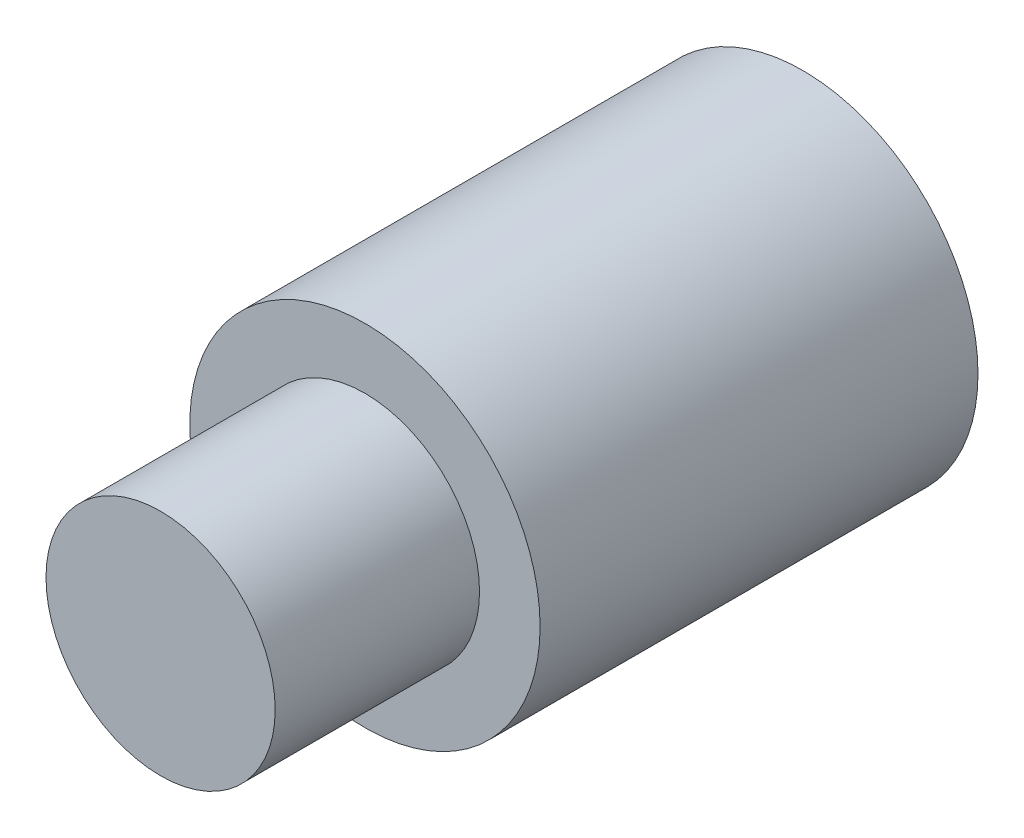
ISO-10303-21;
HEADER;
FILE_DESCRIPTION(('STEP AP214'),'2;1');
FILE_NAME('part.step','',(''),(''),'','','');
FILE_SCHEMA(('AUTOMOTIVE_DESIGN { 1 0 10303 214 1 1 1 1 }'));
ENDSEC;
DATA;
#1=APPLICATION_CONTEXT('core data for automotive mechanical design processes');
#2=APPLICATION_PROTOCOL_DEFINITION('international standard','automotive_design',2000,#1);
#3=PRODUCT_CONTEXT('',#1,'mechanical');
#4=PRODUCT('Part','Part','',(#3));
#5=PRODUCT_RELATED_PRODUCT_CATEGORY('part','',(#4));
#6=PRODUCT_DEFINITION_FORMATION('','',#4);
#7=PRODUCT_DEFINITION_CONTEXT('part definition',#1,'design');
#8=PRODUCT_DEFINITION('design','',#6,#7);
#9=PRODUCT_DEFINITION_SHAPE('','',#8);
#10=(LENGTH_UNIT() NAMED_UNIT(*) SI_UNIT(.MILLI.,.METRE.));
#11=(NAMED_UNIT(*) PLANE_ANGLE_UNIT() SI_UNIT($,.RADIAN.));
#12=(NAMED_UNIT(*) SI_UNIT($,.STERADIAN.) SOLID_ANGLE_UNIT());
#13=UNCERTAINTY_MEASURE_WITH_UNIT(LENGTH_MEASURE(1.E-05),#10,'distance_accuracy_value','');
#14=(GEOMETRIC_REPRESENTATION_CONTEXT(3) GLOBAL_UNCERTAINTY_ASSIGNED_CONTEXT((#13)) GLOBAL_UNIT_ASSIGNED_CONTEXT((#10,
#11,#12)) REPRESENTATION_CONTEXT('',''));
#15=CARTESIAN_POINT('',(0.,0.,0.));
#16=DIRECTION('',(0.,0.,1.));
#17=DIRECTION('',(1.,0.,0.));
#18=AXIS2_PLACEMENT_3D('',#15,#16,#17);
#19=CARTESIAN_POINT('',(0.,0.,15.));
#20=DIRECTION('',(0.,0.,-1.));
#21=DIRECTION('',(-1.,0.,0.));
#22=AXIS2_PLACEMENT_3D('',#19,#20,#21);
#23=CYLINDRICAL_SURFACE('',#22,6.);
#24=CARTESIAN_POINT('',(0.,0.,15.));
#25=DIRECTION('',(0.,0.,1.));
#26=DIRECTION('',(1.,0.,0.));
#27=AXIS2_PLACEMENT_3D('',#24,#25,#26);
#28=CIRCLE('',#27,6.);
#29=CARTESIAN_POINT('',(6.,0.,15.));
#30=VERTEX_POINT('',#29);
#31=EDGE_CURVE('E49',#30,#30,#28,.T.);
#32=ORIENTED_EDGE('',*,*,#31,.F.);
#33=EDGE_LOOP('',(#32));
#34=FACE_BOUND('',#33,.T.);
#35=CARTESIAN_POINT('',(0.,0.,0.));
#36=DIRECTION('',(0.,0.,1.));
#37=DIRECTION('',(1.,0.,0.));
#38=AXIS2_PLACEMENT_3D('',#35,#36,#37);
#39=CIRCLE('',#38,6.);
#40=CARTESIAN_POINT('',(6.,0.,0.));
#41=VERTEX_POINT('',#40);
#42=EDGE_CURVE('E44',#41,#41,#39,.T.);
#43=ORIENTED_EDGE('',*,*,#42,.T.);
#44=EDGE_LOOP('',(#43));
#45=FACE_BOUND('',#44,.T.);
#46=ADVANCED_FACE('F41',(#34,#45),#23,.T.);
#47=CARTESIAN_POINT('',(0.,0.,15.));
#48=DIRECTION('',(0.,0.,1.));
#49=DIRECTION('',(1.,0.,0.));
#50=AXIS2_PLACEMENT_3D('',#47,#48,#49);
#51=PLANE('',#50);
#52=CARTESIAN_POINT('',(0.,0.,15.));
#53=DIRECTION('',(0.,0.,1.));
#54=DIRECTION('',(1.,0.,0.));
#55=AXIS2_PLACEMENT_3D('',#52,#53,#54);
#56=CIRCLE('',#55,3.925);
#57=CARTESIAN_POINT('',(3.925,0.,15.));
#58=VERTEX_POINT('',#57);
#59=EDGE_CURVE('E10',#58,#58,#56,.T.);
#60=ORIENTED_EDGE('',*,*,#59,.F.);
#61=EDGE_LOOP('',(#60));
#62=FACE_BOUND('',#61,.T.);
#63=ORIENTED_EDGE('',*,*,#31,.T.);
#64=EDGE_LOOP('',(#63));
#65=FACE_BOUND('',#64,.T.);
#66=ADVANCED_FACE('F69',(#62,#65),#51,.T.);
#67=CARTESIAN_POINT('',(0.,0.,0.));
#68=DIRECTION('',(0.,0.,1.));
#69=DIRECTION('',(1.,0.,0.));
#70=AXIS2_PLACEMENT_3D('',#67,#68,#69);
#71=PLANE('',#70);
#72=ORIENTED_EDGE('',*,*,#42,.F.);
#73=EDGE_LOOP('',(#72));
#74=FACE_BOUND('',#73,.T.);
#75=ADVANCED_FACE('F66',(#74),#71,.F.);
#76=CARTESIAN_POINT('',(0.,0.,22.));
#77=DIRECTION('',(0.,0.,-1.));
#78=DIRECTION('',(-1.,0.,0.));
#79=AXIS2_PLACEMENT_3D('',#76,#77,#78);
#80=CYLINDRICAL_SURFACE('',#79,3.925);
#81=CARTESIAN_POINT('',(0.,0.,22.));
#82=DIRECTION('',(0.,0.,1.));
#83=DIRECTION('',(1.,0.,0.));
#84=AXIS2_PLACEMENT_3D('',#81,#82,#83);
#85=CIRCLE('',#84,3.925);
#86=CARTESIAN_POINT('',(3.925,0.,22.));
#87=VERTEX_POINT('',#86);
#88=EDGE_CURVE('E57',#87,#87,#85,.T.);
#89=ORIENTED_EDGE('',*,*,#88,.F.);
#90=EDGE_LOOP('',(#89));
#91=FACE_BOUND('',#90,.T.);
#92=ORIENTED_EDGE('',*,*,#59,.T.);
#93=EDGE_LOOP('',(#92));
#94=FACE_BOUND('',#93,.T.);
#95=ADVANCED_FACE('F68',(#91,#94),#80,.T.);
#96=CARTESIAN_POINT('',(0.,0.,22.));
#97=DIRECTION('',(0.,0.,1.));
#98=DIRECTION('',(1.,0.,0.));
#99=AXIS2_PLACEMENT_3D('',#96,#97,#98);
#100=PLANE('',#99);
#101=ORIENTED_EDGE('',*,*,#88,.T.);
#102=EDGE_LOOP('',(#101));
#103=FACE_BOUND('',#102,.T.);
#104=ADVANCED_FACE('F74',(#103),#100,.T.);
#105=CLOSED_SHELL('',(#46,#66,#75,#95,#104));
#106=MANIFOLD_SOLID_BREP('B2',#105);
#107=ADVANCED_BREP_SHAPE_REPRESENTATION('',(#18,#106),#14);
#108=SHAPE_DEFINITION_REPRESENTATION(#9,#107);
ENDSEC;
END-ISO-10303-21;
